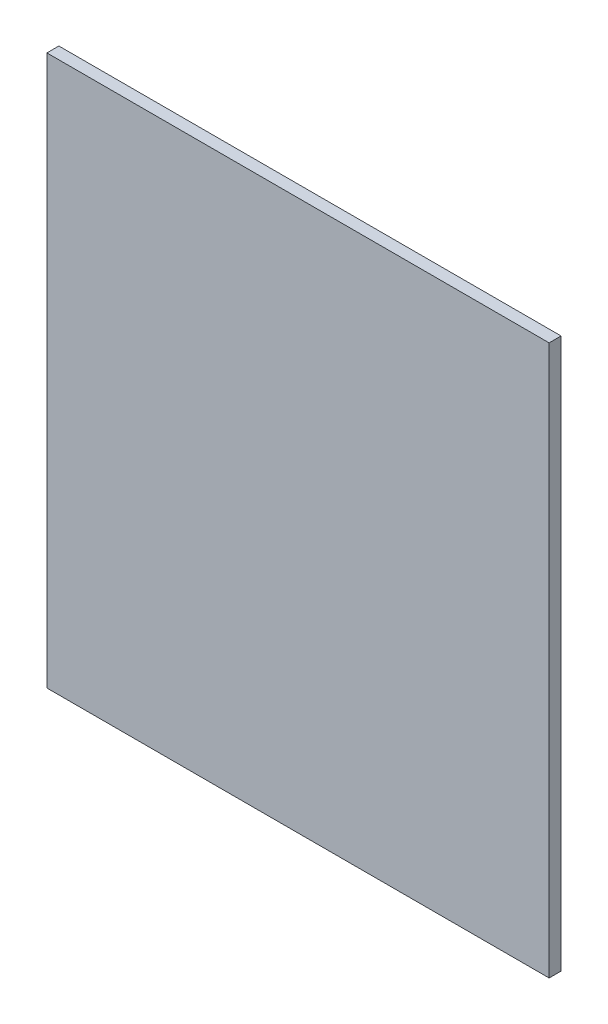
ISO-10303-21;
HEADER;
FILE_DESCRIPTION(('STEP AP214'),'2;1');
FILE_NAME('part.step','',(''),(''),'','','');
FILE_SCHEMA(('AUTOMOTIVE_DESIGN { 1 0 10303 214 1 1 1 1 }'));
ENDSEC;
DATA;
#1=APPLICATION_CONTEXT('core data for automotive mechanical design processes');
#2=APPLICATION_PROTOCOL_DEFINITION('international standard','automotive_design',2000,#1);
#3=PRODUCT_CONTEXT('',#1,'mechanical');
#4=PRODUCT('Part','Part','',(#3));
#5=PRODUCT_RELATED_PRODUCT_CATEGORY('part','',(#4));
#6=PRODUCT_DEFINITION_FORMATION('','',#4);
#7=PRODUCT_DEFINITION_CONTEXT('part definition',#1,'design');
#8=PRODUCT_DEFINITION('design','',#6,#7);
#9=PRODUCT_DEFINITION_SHAPE('','',#8);
#10=(LENGTH_UNIT() NAMED_UNIT(*) SI_UNIT(.MILLI.,.METRE.));
#11=(NAMED_UNIT(*) PLANE_ANGLE_UNIT() SI_UNIT($,.RADIAN.));
#12=(NAMED_UNIT(*) SI_UNIT($,.STERADIAN.) SOLID_ANGLE_UNIT());
#13=UNCERTAINTY_MEASURE_WITH_UNIT(LENGTH_MEASURE(1.E-05),#10,'distance_accuracy_value','');
#14=(GEOMETRIC_REPRESENTATION_CONTEXT(3) GLOBAL_UNCERTAINTY_ASSIGNED_CONTEXT((#13)) GLOBAL_UNIT_ASSIGNED_CONTEXT((#10,
#11,#12)) REPRESENTATION_CONTEXT('',''));
#15=CARTESIAN_POINT('',(0.,0.,0.));
#16=DIRECTION('',(0.,0.,1.));
#17=DIRECTION('',(1.,0.,0.));
#18=AXIS2_PLACEMENT_3D('',#15,#16,#17);
#19=CARTESIAN_POINT('',(0.,0.,12.7));
#20=DIRECTION('',(1.,0.,0.));
#21=DIRECTION('',(0.,0.,-1.));
#22=AXIS2_PLACEMENT_3D('',#19,#20,#21);
#23=PLANE('',#22);
#24=DIRECTION('',(0.,-1.,0.));
#25=VECTOR('',#24,1.);
#26=CARTESIAN_POINT('',(0.,0.,0.));
#27=LINE('',#26,#25);
#28=CARTESIAN_POINT('',(0.,584.2,0.));
#29=VERTEX_POINT('',#28);
#30=CARTESIAN_POINT('',(0.,0.,0.));
#31=VERTEX_POINT('',#30);
#32=EDGE_CURVE('E96',#29,#31,#27,.T.);
#33=ORIENTED_EDGE('',*,*,#32,.T.);
#34=DIRECTION('',(0.,0.,-1.));
#35=VECTOR('',#34,1.);
#36=CARTESIAN_POINT('',(0.,0.,12.7));
#37=LINE('',#36,#35);
#38=CARTESIAN_POINT('',(0.,0.,12.7));
#39=VERTEX_POINT('',#38);
#40=EDGE_CURVE('E11',#39,#31,#37,.T.);
#41=ORIENTED_EDGE('',*,*,#40,.F.);
#42=DIRECTION('',(0.,-1.,0.));
#43=VECTOR('',#42,1.);
#44=CARTESIAN_POINT('',(0.,0.,12.7));
#45=LINE('',#44,#43);
#46=CARTESIAN_POINT('',(0.,584.2,12.7));
#47=VERTEX_POINT('',#46);
#48=EDGE_CURVE('E84',#47,#39,#45,.T.);
#49=ORIENTED_EDGE('',*,*,#48,.F.);
#50=DIRECTION('',(0.,0.,-1.));
#51=VECTOR('',#50,1.);
#52=CARTESIAN_POINT('',(0.,584.2,12.7));
#53=LINE('',#52,#51);
#54=EDGE_CURVE('E92',#47,#29,#53,.T.);
#55=ORIENTED_EDGE('',*,*,#54,.T.);
#56=EDGE_LOOP('',(#33,#41,#49,#55));
#57=FACE_BOUND('',#56,.T.);
#58=ADVANCED_FACE('F33',(#57),#23,.F.);
#59=CARTESIAN_POINT('',(0.,0.,12.7));
#60=DIRECTION('',(0.,1.,0.));
#61=DIRECTION('',(0.,0.,1.));
#62=AXIS2_PLACEMENT_3D('',#59,#60,#61);
#63=PLANE('',#62);
#64=DIRECTION('',(1.,0.,0.));
#65=VECTOR('',#64,1.);
#66=CARTESIAN_POINT('',(0.,0.,0.));
#67=LINE('',#66,#65);
#68=CARTESIAN_POINT('',(533.4,0.,0.));
#69=VERTEX_POINT('',#68);
#70=EDGE_CURVE('E88',#31,#69,#67,.T.);
#71=ORIENTED_EDGE('',*,*,#70,.T.);
#72=DIRECTION('',(0.,0.,-1.));
#73=VECTOR('',#72,1.);
#74=CARTESIAN_POINT('',(533.4,0.,12.7));
#75=LINE('',#74,#73);
#76=CARTESIAN_POINT('',(533.4,0.,12.7));
#77=VERTEX_POINT('',#76);
#78=EDGE_CURVE('E41',#77,#69,#75,.T.);
#79=ORIENTED_EDGE('',*,*,#78,.F.);
#80=DIRECTION('',(1.,0.,0.));
#81=VECTOR('',#80,1.);
#82=CARTESIAN_POINT('',(0.,0.,12.7));
#83=LINE('',#82,#81);
#84=EDGE_CURVE('E79',#39,#77,#83,.T.);
#85=ORIENTED_EDGE('',*,*,#84,.F.);
#86=ORIENTED_EDGE('',*,*,#40,.T.);
#87=EDGE_LOOP('',(#71,#79,#85,#86));
#88=FACE_BOUND('',#87,.T.);
#89=ADVANCED_FACE('F87',(#88),#63,.F.);
#90=CARTESIAN_POINT('',(533.4,0.,12.7));
#91=DIRECTION('',(-1.,0.,0.));
#92=DIRECTION('',(0.,0.,1.));
#93=AXIS2_PLACEMENT_3D('',#90,#91,#92);
#94=PLANE('',#93);
#95=DIRECTION('',(0.,1.,0.));
#96=VECTOR('',#95,1.);
#97=CARTESIAN_POINT('',(533.4,0.,0.));
#98=LINE('',#97,#96);
#99=CARTESIAN_POINT('',(533.4,584.2,0.));
#100=VERTEX_POINT('',#99);
#101=EDGE_CURVE('E66',#69,#100,#98,.T.);
#102=ORIENTED_EDGE('',*,*,#101,.T.);
#103=DIRECTION('',(0.,0.,-1.));
#104=VECTOR('',#103,1.);
#105=CARTESIAN_POINT('',(533.4,584.2,12.7));
#106=LINE('',#105,#104);
#107=CARTESIAN_POINT('',(533.4,584.2,12.7));
#108=VERTEX_POINT('',#107);
#109=EDGE_CURVE('E89',#108,#100,#106,.T.);
#110=ORIENTED_EDGE('',*,*,#109,.F.);
#111=DIRECTION('',(0.,1.,0.));
#112=VECTOR('',#111,1.);
#113=CARTESIAN_POINT('',(533.4,0.,12.7));
#114=LINE('',#113,#112);
#115=EDGE_CURVE('E82',#77,#108,#114,.T.);
#116=ORIENTED_EDGE('',*,*,#115,.F.);
#117=ORIENTED_EDGE('',*,*,#78,.T.);
#118=EDGE_LOOP('',(#102,#110,#116,#117));
#119=FACE_BOUND('',#118,.T.);
#120=ADVANCED_FACE('F90',(#119),#94,.F.);
#121=CARTESIAN_POINT('',(0.,584.2,12.7));
#122=DIRECTION('',(0.,-1.,0.));
#123=DIRECTION('',(0.,0.,-1.));
#124=AXIS2_PLACEMENT_3D('',#121,#122,#123);
#125=PLANE('',#124);
#126=DIRECTION('',(-1.,0.,0.));
#127=VECTOR('',#126,1.);
#128=CARTESIAN_POINT('',(0.,584.2,0.));
#129=LINE('',#128,#127);
#130=EDGE_CURVE('E72',#100,#29,#129,.T.);
#131=ORIENTED_EDGE('',*,*,#130,.T.);
#132=ORIENTED_EDGE('',*,*,#54,.F.);
#133=DIRECTION('',(-1.,0.,0.));
#134=VECTOR('',#133,1.);
#135=CARTESIAN_POINT('',(0.,584.2,12.7));
#136=LINE('',#135,#134);
#137=EDGE_CURVE('E49',#108,#47,#136,.T.);
#138=ORIENTED_EDGE('',*,*,#137,.F.);
#139=ORIENTED_EDGE('',*,*,#109,.T.);
#140=EDGE_LOOP('',(#131,#132,#138,#139));
#141=FACE_BOUND('',#140,.T.);
#142=ADVANCED_FACE('F103',(#141),#125,.F.);
#143=CARTESIAN_POINT('',(0.,0.,12.7));
#144=DIRECTION('',(0.,0.,-1.));
#145=DIRECTION('',(-1.,0.,0.));
#146=AXIS2_PLACEMENT_3D('',#143,#144,#145);
#147=PLANE('',#146);
#148=ORIENTED_EDGE('',*,*,#48,.T.);
#149=ORIENTED_EDGE('',*,*,#84,.T.);
#150=ORIENTED_EDGE('',*,*,#115,.T.);
#151=ORIENTED_EDGE('',*,*,#137,.T.);
#152=EDGE_LOOP('',(#148,#149,#150,#151));
#153=FACE_BOUND('',#152,.T.);
#154=ADVANCED_FACE('F80',(#153),#147,.F.);
#155=CARTESIAN_POINT('',(0.,0.,0.));
#156=DIRECTION('',(0.,0.,-1.));
#157=DIRECTION('',(-1.,0.,0.));
#158=AXIS2_PLACEMENT_3D('',#155,#156,#157);
#159=PLANE('',#158);
#160=ORIENTED_EDGE('',*,*,#32,.F.);
#161=ORIENTED_EDGE('',*,*,#130,.F.);
#162=ORIENTED_EDGE('',*,*,#101,.F.);
#163=ORIENTED_EDGE('',*,*,#70,.F.);
#164=EDGE_LOOP('',(#160,#161,#162,#163));
#165=FACE_BOUND('',#164,.T.);
#166=ADVANCED_FACE('F106',(#165),#159,.T.);
#167=CLOSED_SHELL('',(#58,#89,#120,#142,#154,#166));
#168=MANIFOLD_SOLID_BREP('B2',#167);
#169=ADVANCED_BREP_SHAPE_REPRESENTATION('',(#18,#168),#14);
#170=SHAPE_DEFINITION_REPRESENTATION(#9,#169);
ENDSEC;
END-ISO-10303-21;
